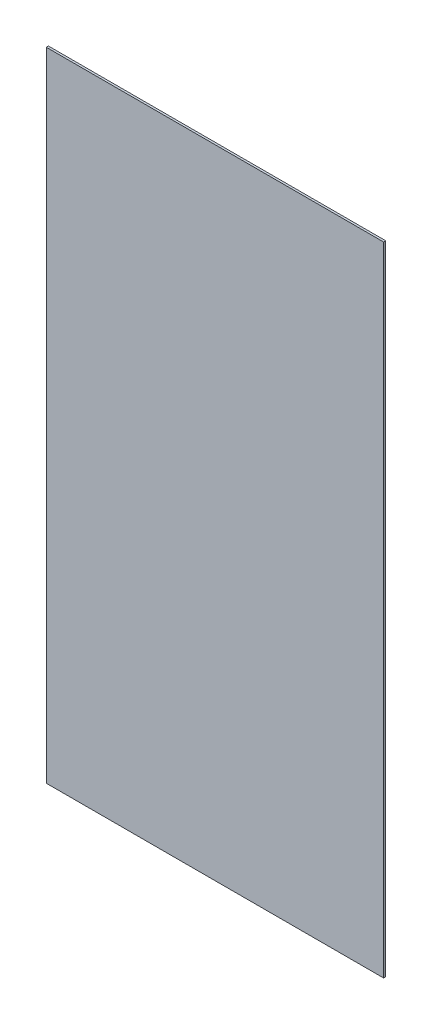
ISO-10303-21;
HEADER;
FILE_DESCRIPTION(('STEP AP214'),'2;1');
FILE_NAME('part.step','',(''),(''),'','','');
FILE_SCHEMA(('AUTOMOTIVE_DESIGN { 1 0 10303 214 1 1 1 1 }'));
ENDSEC;
DATA;
#1=APPLICATION_CONTEXT('core data for automotive mechanical design processes');
#2=APPLICATION_PROTOCOL_DEFINITION('international standard','automotive_design',2000,#1);
#3=PRODUCT_CONTEXT('',#1,'mechanical');
#4=PRODUCT('Part','Part','',(#3));
#5=PRODUCT_RELATED_PRODUCT_CATEGORY('part','',(#4));
#6=PRODUCT_DEFINITION_FORMATION('','',#4);
#7=PRODUCT_DEFINITION_CONTEXT('part definition',#1,'design');
#8=PRODUCT_DEFINITION('design','',#6,#7);
#9=PRODUCT_DEFINITION_SHAPE('','',#8);
#10=(LENGTH_UNIT() NAMED_UNIT(*) SI_UNIT(.MILLI.,.METRE.));
#11=(NAMED_UNIT(*) PLANE_ANGLE_UNIT() SI_UNIT($,.RADIAN.));
#12=(NAMED_UNIT(*) SI_UNIT($,.STERADIAN.) SOLID_ANGLE_UNIT());
#13=UNCERTAINTY_MEASURE_WITH_UNIT(LENGTH_MEASURE(1.E-05),#10,'distance_accuracy_value','');
#14=(GEOMETRIC_REPRESENTATION_CONTEXT(3) GLOBAL_UNCERTAINTY_ASSIGNED_CONTEXT((#13)) GLOBAL_UNIT_ASSIGNED_CONTEXT((#10,
#11,#12)) REPRESENTATION_CONTEXT('',''));
#15=CARTESIAN_POINT('',(0.,0.,0.));
#16=DIRECTION('',(0.,0.,1.));
#17=DIRECTION('',(1.,0.,0.));
#18=AXIS2_PLACEMENT_3D('',#15,#16,#17);
#19=CARTESIAN_POINT('',(317.5,-600.,4.));
#20=DIRECTION('',(-1.,0.,0.));
#21=DIRECTION('',(0.,0.,1.));
#22=AXIS2_PLACEMENT_3D('',#19,#20,#21);
#23=PLANE('',#22);
#24=DIRECTION('',(0.,1.,0.));
#25=VECTOR('',#24,1.);
#26=CARTESIAN_POINT('',(317.5,-600.,0.));
#27=LINE('',#26,#25);
#28=CARTESIAN_POINT('',(317.5,-600.,0.));
#29=VERTEX_POINT('',#28);
#30=CARTESIAN_POINT('',(317.5,600.,0.));
#31=VERTEX_POINT('',#30);
#32=EDGE_CURVE('E98',#29,#31,#27,.T.);
#33=ORIENTED_EDGE('',*,*,#32,.T.);
#34=DIRECTION('',(0.,0.,-1.));
#35=VECTOR('',#34,1.);
#36=CARTESIAN_POINT('',(317.5,600.,4.));
#37=LINE('',#36,#35);
#38=CARTESIAN_POINT('',(317.5,600.,4.));
#39=VERTEX_POINT('',#38);
#40=EDGE_CURVE('E11',#39,#31,#37,.T.);
#41=ORIENTED_EDGE('',*,*,#40,.F.);
#42=DIRECTION('',(0.,1.,0.));
#43=VECTOR('',#42,1.);
#44=CARTESIAN_POINT('',(317.5,-600.,4.));
#45=LINE('',#44,#43);
#46=CARTESIAN_POINT('',(317.5,-600.,4.));
#47=VERTEX_POINT('',#46);
#48=EDGE_CURVE('E86',#47,#39,#45,.T.);
#49=ORIENTED_EDGE('',*,*,#48,.F.);
#50=DIRECTION('',(0.,0.,-1.));
#51=VECTOR('',#50,1.);
#52=CARTESIAN_POINT('',(317.5,-600.,4.));
#53=LINE('',#52,#51);
#54=EDGE_CURVE('E94',#47,#29,#53,.T.);
#55=ORIENTED_EDGE('',*,*,#54,.T.);
#56=EDGE_LOOP('',(#33,#41,#49,#55));
#57=FACE_BOUND('',#56,.T.);
#58=ADVANCED_FACE('F35',(#57),#23,.F.);
#59=CARTESIAN_POINT('',(-317.5,600.,4.));
#60=DIRECTION('',(0.,-1.,0.));
#61=DIRECTION('',(0.,0.,-1.));
#62=AXIS2_PLACEMENT_3D('',#59,#60,#61);
#63=PLANE('',#62);
#64=DIRECTION('',(-1.,0.,0.));
#65=VECTOR('',#64,1.);
#66=CARTESIAN_POINT('',(-317.5,600.,0.));
#67=LINE('',#66,#65);
#68=CARTESIAN_POINT('',(-317.5,600.,0.));
#69=VERTEX_POINT('',#68);
#70=EDGE_CURVE('E90',#31,#69,#67,.T.);
#71=ORIENTED_EDGE('',*,*,#70,.T.);
#72=DIRECTION('',(0.,0.,-1.));
#73=VECTOR('',#72,1.);
#74=CARTESIAN_POINT('',(-317.5,600.,4.));
#75=LINE('',#74,#73);
#76=CARTESIAN_POINT('',(-317.5,600.,4.));
#77=VERTEX_POINT('',#76);
#78=EDGE_CURVE('E43',#77,#69,#75,.T.);
#79=ORIENTED_EDGE('',*,*,#78,.F.);
#80=DIRECTION('',(-1.,0.,0.));
#81=VECTOR('',#80,1.);
#82=CARTESIAN_POINT('',(-317.5,600.,4.));
#83=LINE('',#82,#81);
#84=EDGE_CURVE('E81',#39,#77,#83,.T.);
#85=ORIENTED_EDGE('',*,*,#84,.F.);
#86=ORIENTED_EDGE('',*,*,#40,.T.);
#87=EDGE_LOOP('',(#71,#79,#85,#86));
#88=FACE_BOUND('',#87,.T.);
#89=ADVANCED_FACE('F89',(#88),#63,.F.);
#90=CARTESIAN_POINT('',(-317.5,-600.,4.));
#91=DIRECTION('',(1.,0.,0.));
#92=DIRECTION('',(0.,0.,-1.));
#93=AXIS2_PLACEMENT_3D('',#90,#91,#92);
#94=PLANE('',#93);
#95=DIRECTION('',(0.,-1.,0.));
#96=VECTOR('',#95,1.);
#97=CARTESIAN_POINT('',(-317.5,-600.,0.));
#98=LINE('',#97,#96);
#99=CARTESIAN_POINT('',(-317.5,-600.,0.));
#100=VERTEX_POINT('',#99);
#101=EDGE_CURVE('E68',#69,#100,#98,.T.);
#102=ORIENTED_EDGE('',*,*,#101,.T.);
#103=DIRECTION('',(0.,0.,-1.));
#104=VECTOR('',#103,1.);
#105=CARTESIAN_POINT('',(-317.5,-600.,4.));
#106=LINE('',#105,#104);
#107=CARTESIAN_POINT('',(-317.5,-600.,4.));
#108=VERTEX_POINT('',#107);
#109=EDGE_CURVE('E91',#108,#100,#106,.T.);
#110=ORIENTED_EDGE('',*,*,#109,.F.);
#111=DIRECTION('',(0.,-1.,0.));
#112=VECTOR('',#111,1.);
#113=CARTESIAN_POINT('',(-317.5,-600.,4.));
#114=LINE('',#113,#112);
#115=EDGE_CURVE('E84',#77,#108,#114,.T.);
#116=ORIENTED_EDGE('',*,*,#115,.F.);
#117=ORIENTED_EDGE('',*,*,#78,.T.);
#118=EDGE_LOOP('',(#102,#110,#116,#117));
#119=FACE_BOUND('',#118,.T.);
#120=ADVANCED_FACE('F92',(#119),#94,.F.);
#121=CARTESIAN_POINT('',(-317.5,-600.,4.));
#122=DIRECTION('',(0.,1.,0.));
#123=DIRECTION('',(0.,0.,1.));
#124=AXIS2_PLACEMENT_3D('',#121,#122,#123);
#125=PLANE('',#124);
#126=DIRECTION('',(1.,0.,0.));
#127=VECTOR('',#126,1.);
#128=CARTESIAN_POINT('',(-317.5,-600.,0.));
#129=LINE('',#128,#127);
#130=EDGE_CURVE('E74',#100,#29,#129,.T.);
#131=ORIENTED_EDGE('',*,*,#130,.T.);
#132=ORIENTED_EDGE('',*,*,#54,.F.);
#133=DIRECTION('',(1.,0.,0.));
#134=VECTOR('',#133,1.);
#135=CARTESIAN_POINT('',(-317.5,-600.,4.));
#136=LINE('',#135,#134);
#137=EDGE_CURVE('E51',#108,#47,#136,.T.);
#138=ORIENTED_EDGE('',*,*,#137,.F.);
#139=ORIENTED_EDGE('',*,*,#109,.T.);
#140=EDGE_LOOP('',(#131,#132,#138,#139));
#141=FACE_BOUND('',#140,.T.);
#142=ADVANCED_FACE('F105',(#141),#125,.F.);
#143=CARTESIAN_POINT('',(0.,0.,4.));
#144=DIRECTION('',(0.,0.,-1.));
#145=DIRECTION('',(-1.,0.,0.));
#146=AXIS2_PLACEMENT_3D('',#143,#144,#145);
#147=PLANE('',#146);
#148=ORIENTED_EDGE('',*,*,#48,.T.);
#149=ORIENTED_EDGE('',*,*,#84,.T.);
#150=ORIENTED_EDGE('',*,*,#115,.T.);
#151=ORIENTED_EDGE('',*,*,#137,.T.);
#152=EDGE_LOOP('',(#148,#149,#150,#151));
#153=FACE_BOUND('',#152,.T.);
#154=ADVANCED_FACE('F82',(#153),#147,.F.);
#155=CARTESIAN_POINT('',(0.,0.,0.));
#156=DIRECTION('',(0.,0.,-1.));
#157=DIRECTION('',(-1.,0.,0.));
#158=AXIS2_PLACEMENT_3D('',#155,#156,#157);
#159=PLANE('',#158);
#160=ORIENTED_EDGE('',*,*,#32,.F.);
#161=ORIENTED_EDGE('',*,*,#130,.F.);
#162=ORIENTED_EDGE('',*,*,#101,.F.);
#163=ORIENTED_EDGE('',*,*,#70,.F.);
#164=EDGE_LOOP('',(#160,#161,#162,#163));
#165=FACE_BOUND('',#164,.T.);
#166=ADVANCED_FACE('F108',(#165),#159,.T.);
#167=CLOSED_SHELL('',(#58,#89,#120,#142,#154,#166));
#168=MANIFOLD_SOLID_BREP('B2',#167);
#169=ADVANCED_BREP_SHAPE_REPRESENTATION('',(#18,#168),#14);
#170=SHAPE_DEFINITION_REPRESENTATION(#9,#169);
ENDSEC;
END-ISO-10303-21;
